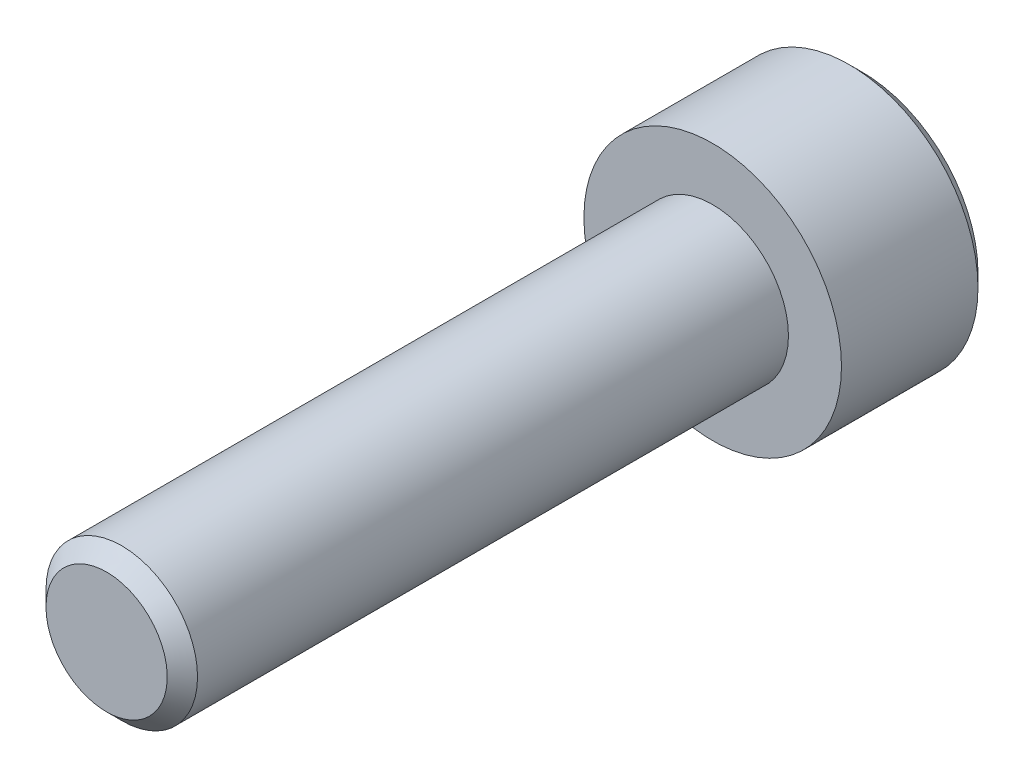
ISO-10303-21;
HEADER;
FILE_DESCRIPTION(('STEP AP214'),'2;1');
FILE_NAME('part.step','',(''),(''),'','','');
FILE_SCHEMA(('AUTOMOTIVE_DESIGN { 1 0 10303 214 1 1 1 1 }'));
ENDSEC;
DATA;
#1=APPLICATION_CONTEXT('core data for automotive mechanical design processes');
#2=APPLICATION_PROTOCOL_DEFINITION('international standard','automotive_design',2000,#1);
#3=PRODUCT_CONTEXT('',#1,'mechanical');
#4=PRODUCT('Part','Part','',(#3));
#5=PRODUCT_RELATED_PRODUCT_CATEGORY('part','',(#4));
#6=PRODUCT_DEFINITION_FORMATION('','',#4);
#7=PRODUCT_DEFINITION_CONTEXT('part definition',#1,'design');
#8=PRODUCT_DEFINITION('design','',#6,#7);
#9=PRODUCT_DEFINITION_SHAPE('','',#8);
#10=(LENGTH_UNIT() NAMED_UNIT(*) SI_UNIT(.MILLI.,.METRE.));
#11=(NAMED_UNIT(*) PLANE_ANGLE_UNIT() SI_UNIT($,.RADIAN.));
#12=(NAMED_UNIT(*) SI_UNIT($,.STERADIAN.) SOLID_ANGLE_UNIT());
#13=UNCERTAINTY_MEASURE_WITH_UNIT(LENGTH_MEASURE(1.E-05),#10,'distance_accuracy_value','');
#14=(GEOMETRIC_REPRESENTATION_CONTEXT(3) GLOBAL_UNCERTAINTY_ASSIGNED_CONTEXT((#13)) GLOBAL_UNIT_ASSIGNED_CONTEXT((#10,
#11,#12)) REPRESENTATION_CONTEXT('',''));
#15=CARTESIAN_POINT('',(0.,0.,0.));
#16=DIRECTION('',(0.,0.,1.));
#17=DIRECTION('',(1.,0.,0.));
#18=AXIS2_PLACEMENT_3D('',#15,#16,#17);
#19=CARTESIAN_POINT('',(0.,0.,-2.43));
#20=DIRECTION('',(0.,0.,1.));
#21=DIRECTION('',(1.,0.,0.));
#22=AXIS2_PLACEMENT_3D('',#19,#20,#21);
#23=PLANE('',#22);
#24=DIRECTION('',(-0.866025403784439,0.5,0.));
#25=VECTOR('',#24,1.);
#26=CARTESIAN_POINT('',(0.,2.3094010767585,-2.43));
#27=LINE('',#26,#25);
#28=CARTESIAN_POINT('',(0.,2.3094010767585,-2.43));
#29=VERTEX_POINT('',#28);
#30=CARTESIAN_POINT('',(2.,1.15470053837925,-2.43));
#31=VERTEX_POINT('',#30);
#32=EDGE_CURVE('E130',#29,#31,#27,.F.);
#33=ORIENTED_EDGE('',*,*,#32,.T.);
#34=DIRECTION('',(0.,1.,0.));
#35=VECTOR('',#34,1.);
#36=CARTESIAN_POINT('',(2.,1.15470053837925,-2.43));
#37=LINE('',#36,#35);
#38=CARTESIAN_POINT('',(2.,-1.15470053837925,-2.43));
#39=VERTEX_POINT('',#38);
#40=EDGE_CURVE('E125',#31,#39,#37,.F.);
#41=ORIENTED_EDGE('',*,*,#40,.T.);
#42=DIRECTION('',(0.866025403784439,0.499999999999999,0.));
#43=VECTOR('',#42,1.);
#44=CARTESIAN_POINT('',(2.,-1.15470053837925,-2.43));
#45=LINE('',#44,#43);
#46=CARTESIAN_POINT('',(0.,-2.3094010767585,-2.43));
#47=VERTEX_POINT('',#46);
#48=EDGE_CURVE('E74',#39,#47,#45,.F.);
#49=ORIENTED_EDGE('',*,*,#48,.T.);
#50=DIRECTION('',(0.866025403784438,-0.5,0.));
#51=VECTOR('',#50,1.);
#52=CARTESIAN_POINT('',(0.,-2.3094010767585,-2.43));
#53=LINE('',#52,#51);
#54=CARTESIAN_POINT('',(-2.,-1.15470053837925,-2.43));
#55=VERTEX_POINT('',#54);
#56=EDGE_CURVE('E71',#47,#55,#53,.F.);
#57=ORIENTED_EDGE('',*,*,#56,.T.);
#58=DIRECTION('',(0.,1.,0.));
#59=VECTOR('',#58,1.);
#60=CARTESIAN_POINT('',(-2.,-1.15470053837925,-2.43));
#61=LINE('',#60,#59);
#62=CARTESIAN_POINT('',(-2.,1.15470053837925,-2.43));
#63=VERTEX_POINT('',#62);
#64=EDGE_CURVE('E68',#55,#63,#61,.T.);
#65=ORIENTED_EDGE('',*,*,#64,.T.);
#66=DIRECTION('',(-0.866025403784439,-0.5,0.));
#67=VECTOR('',#66,1.);
#68=CARTESIAN_POINT('',(-2.,1.15470053837925,-2.43));
#69=LINE('',#68,#67);
#70=EDGE_CURVE('E91',#63,#29,#69,.F.);
#71=ORIENTED_EDGE('',*,*,#70,.T.);
#72=EDGE_LOOP('',(#33,#41,#49,#57,#65,#71));
#73=FACE_BOUND('',#72,.T.);
#74=ADVANCED_FACE('F17',(#73),#23,.F.);
#75=CARTESIAN_POINT('',(0.,-2.3094010767585,-4.93));
#76=DIRECTION('',(-0.5,-0.866025403784438,0.));
#77=DIRECTION('',(0.866025403784438,-0.5,0.));
#78=AXIS2_PLACEMENT_3D('',#75,#76,#77);
#79=PLANE('',#78);
#80=ORIENTED_EDGE('',*,*,#56,.F.);
#81=DIRECTION('',(0.,0.,1.));
#82=VECTOR('',#81,1.);
#83=CARTESIAN_POINT('',(0.,-2.3094010767585,-4.93));
#84=LINE('',#83,#82);
#85=CARTESIAN_POINT('',(0.,-2.3094010767585,-4.93));
#86=VERTEX_POINT('',#85);
#87=EDGE_CURVE('E120',#47,#86,#84,.F.);
#88=ORIENTED_EDGE('',*,*,#87,.T.);
#89=DIRECTION('',(-0.866025403784439,0.5,0.));
#90=VECTOR('',#89,1.);
#91=CARTESIAN_POINT('',(0.,-2.3094010767585,-4.93));
#92=LINE('',#91,#90);
#93=CARTESIAN_POINT('',(-2.,-1.15470053837925,-4.93));
#94=VERTEX_POINT('',#93);
#95=EDGE_CURVE('E82',#86,#94,#92,.T.);
#96=ORIENTED_EDGE('',*,*,#95,.T.);
#97=DIRECTION('',(0.,0.,1.));
#98=VECTOR('',#97,1.);
#99=CARTESIAN_POINT('',(-2.,-1.15470053837925,-4.93));
#100=LINE('',#99,#98);
#101=EDGE_CURVE('E77',#94,#55,#100,.T.);
#102=ORIENTED_EDGE('',*,*,#101,.T.);
#103=EDGE_LOOP('',(#80,#88,#96,#102));
#104=FACE_BOUND('',#103,.T.);
#105=ADVANCED_FACE('F80',(#104),#79,.F.);
#106=CARTESIAN_POINT('',(-2.,-1.15470053837925,-4.93));
#107=DIRECTION('',(-1.,0.,0.));
#108=DIRECTION('',(0.,0.,1.));
#109=AXIS2_PLACEMENT_3D('',#106,#107,#108);
#110=PLANE('',#109);
#111=ORIENTED_EDGE('',*,*,#64,.F.);
#112=ORIENTED_EDGE('',*,*,#101,.F.);
#113=DIRECTION('',(0.,1.,0.));
#114=VECTOR('',#113,1.);
#115=CARTESIAN_POINT('',(-2.,0.,-4.93));
#116=LINE('',#115,#114);
#117=CARTESIAN_POINT('',(-2.,1.15470053837925,-4.93));
#118=VERTEX_POINT('',#117);
#119=EDGE_CURVE('E117',#94,#118,#116,.T.);
#120=ORIENTED_EDGE('',*,*,#119,.T.);
#121=DIRECTION('',(0.,0.,1.));
#122=VECTOR('',#121,1.);
#123=CARTESIAN_POINT('',(-2.,1.15470053837925,-4.93));
#124=LINE('',#123,#122);
#125=EDGE_CURVE('E88',#118,#63,#124,.T.);
#126=ORIENTED_EDGE('',*,*,#125,.T.);
#127=EDGE_LOOP('',(#111,#112,#120,#126));
#128=FACE_BOUND('',#127,.T.);
#129=ADVANCED_FACE('F86',(#128),#110,.F.);
#130=CARTESIAN_POINT('',(-2.,1.15470053837925,-4.93));
#131=DIRECTION('',(-0.5,0.866025403784439,0.));
#132=DIRECTION('',(-0.866025403784439,-0.5,0.));
#133=AXIS2_PLACEMENT_3D('',#130,#131,#132);
#134=PLANE('',#133);
#135=ORIENTED_EDGE('',*,*,#70,.F.);
#136=ORIENTED_EDGE('',*,*,#125,.F.);
#137=DIRECTION('',(0.866025403784439,0.499999999999999,0.));
#138=VECTOR('',#137,1.);
#139=CARTESIAN_POINT('',(-2.,1.15470053837925,-4.93));
#140=LINE('',#139,#138);
#141=CARTESIAN_POINT('',(0.,2.3094010767585,-4.93));
#142=VERTEX_POINT('',#141);
#143=EDGE_CURVE('E115',#118,#142,#140,.T.);
#144=ORIENTED_EDGE('',*,*,#143,.T.);
#145=DIRECTION('',(0.,0.,1.));
#146=VECTOR('',#145,1.);
#147=CARTESIAN_POINT('',(0.,2.3094010767585,-4.93));
#148=LINE('',#147,#146);
#149=EDGE_CURVE('E132',#142,#29,#148,.T.);
#150=ORIENTED_EDGE('',*,*,#149,.T.);
#151=EDGE_LOOP('',(#135,#136,#144,#150));
#152=FACE_BOUND('',#151,.T.);
#153=ADVANCED_FACE('F137',(#152),#134,.F.);
#154=CARTESIAN_POINT('',(0.,2.3094010767585,-4.93));
#155=DIRECTION('',(0.5,0.866025403784439,0.));
#156=DIRECTION('',(-0.866025403784439,0.5,0.));
#157=AXIS2_PLACEMENT_3D('',#154,#155,#156);
#158=PLANE('',#157);
#159=ORIENTED_EDGE('',*,*,#32,.F.);
#160=ORIENTED_EDGE('',*,*,#149,.F.);
#161=DIRECTION('',(0.866025403784439,-0.5,0.));
#162=VECTOR('',#161,1.);
#163=CARTESIAN_POINT('',(0.,2.3094010767585,-4.93));
#164=LINE('',#163,#162);
#165=CARTESIAN_POINT('',(2.,1.15470053837925,-4.93));
#166=VERTEX_POINT('',#165);
#167=EDGE_CURVE('E113',#142,#166,#164,.T.);
#168=ORIENTED_EDGE('',*,*,#167,.T.);
#169=DIRECTION('',(0.,0.,-1.));
#170=VECTOR('',#169,1.);
#171=CARTESIAN_POINT('',(2.,1.15470053837925,-4.93));
#172=LINE('',#171,#170);
#173=EDGE_CURVE('E127',#166,#31,#172,.F.);
#174=ORIENTED_EDGE('',*,*,#173,.T.);
#175=EDGE_LOOP('',(#159,#160,#168,#174));
#176=FACE_BOUND('',#175,.T.);
#177=ADVANCED_FACE('F141',(#176),#158,.F.);
#178=CARTESIAN_POINT('',(2.,1.15470053837925,-4.93));
#179=DIRECTION('',(1.,0.,0.));
#180=DIRECTION('',(0.,0.,-1.));
#181=AXIS2_PLACEMENT_3D('',#178,#179,#180);
#182=PLANE('',#181);
#183=ORIENTED_EDGE('',*,*,#40,.F.);
#184=ORIENTED_EDGE('',*,*,#173,.F.);
#185=DIRECTION('',(0.,1.,0.));
#186=VECTOR('',#185,1.);
#187=CARTESIAN_POINT('',(2.,0.,-4.93));
#188=LINE('',#187,#186);
#189=CARTESIAN_POINT('',(2.,-1.15470053837925,-4.93));
#190=VERTEX_POINT('',#189);
#191=EDGE_CURVE('E35',#166,#190,#188,.F.);
#192=ORIENTED_EDGE('',*,*,#191,.T.);
#193=DIRECTION('',(0.,0.,1.));
#194=VECTOR('',#193,1.);
#195=CARTESIAN_POINT('',(2.,-1.15470053837925,-4.93));
#196=LINE('',#195,#194);
#197=EDGE_CURVE('E123',#190,#39,#196,.T.);
#198=ORIENTED_EDGE('',*,*,#197,.T.);
#199=EDGE_LOOP('',(#183,#184,#192,#198));
#200=FACE_BOUND('',#199,.T.);
#201=ADVANCED_FACE('F143',(#200),#182,.F.);
#202=CARTESIAN_POINT('',(2.,-1.15470053837925,-4.93));
#203=DIRECTION('',(0.499999999999999,-0.866025403784439,0.));
#204=DIRECTION('',(0.866025403784439,0.499999999999999,0.));
#205=AXIS2_PLACEMENT_3D('',#202,#203,#204);
#206=PLANE('',#205);
#207=ORIENTED_EDGE('',*,*,#48,.F.);
#208=ORIENTED_EDGE('',*,*,#197,.F.);
#209=DIRECTION('',(-0.866025403784439,-0.499999999999999,0.));
#210=VECTOR('',#209,1.);
#211=CARTESIAN_POINT('',(2.,-1.15470053837925,-4.93));
#212=LINE('',#211,#210);
#213=EDGE_CURVE('E107',#190,#86,#212,.T.);
#214=ORIENTED_EDGE('',*,*,#213,.T.);
#215=ORIENTED_EDGE('',*,*,#87,.F.);
#216=EDGE_LOOP('',(#207,#208,#214,#215));
#217=FACE_BOUND('',#216,.T.);
#218=ADVANCED_FACE('F146',(#217),#206,.F.);
#219=CARTESIAN_POINT('',(0.,0.,-4.93));
#220=DIRECTION('',(0.,0.,1.));
#221=DIRECTION('',(1.,0.,0.));
#222=AXIS2_PLACEMENT_3D('',#219,#220,#221);
#223=PLANE('',#222);
#224=ORIENTED_EDGE('',*,*,#191,.F.);
#225=ORIENTED_EDGE('',*,*,#167,.F.);
#226=ORIENTED_EDGE('',*,*,#143,.F.);
#227=ORIENTED_EDGE('',*,*,#119,.F.);
#228=ORIENTED_EDGE('',*,*,#95,.F.);
#229=ORIENTED_EDGE('',*,*,#213,.F.);
#230=EDGE_LOOP('',(#224,#225,#226,#227,#228,#229));
#231=FACE_BOUND('',#230,.T.);
#232=CARTESIAN_POINT('',(0.,0.,-4.9300000000585));
#233=DIRECTION('',(0.,0.,1.));
#234=DIRECTION('',(1.,0.,0.));
#235=AXIS2_PLACEMENT_3D('',#232,#233,#234);
#236=CIRCLE('',#235,3.82500000000618);
#237=CARTESIAN_POINT('',(3.82500000000618,0.,-4.9300000000585));
#238=VERTEX_POINT('',#237);
#239=EDGE_CURVE('E20',#238,#238,#236,.T.);
#240=ORIENTED_EDGE('',*,*,#239,.F.);
#241=EDGE_LOOP('',(#240));
#242=FACE_BOUND('',#241,.T.);
#243=ADVANCED_FACE('F148',(#231,#242),#223,.F.);
#244=CARTESIAN_POINT('',(0.,0.,-4.50499999999465));
#245=DIRECTION('',(0.,0.,1.));
#246=DIRECTION('',(1.,0.,0.));
#247=AXIS2_PLACEMENT_3D('',#244,#245,#246);
#248=CONICAL_SURFACE('',#247,4.25000000007003,0.785398163397448);
#249=ORIENTED_EDGE('',*,*,#239,.T.);
#250=EDGE_LOOP('',(#249));
#251=FACE_BOUND('',#250,.T.);
#252=CARTESIAN_POINT('',(0.,0.,-4.505));
#253=DIRECTION('',(0.,0.,1.));
#254=DIRECTION('',(1.,0.,0.));
#255=AXIS2_PLACEMENT_3D('',#252,#253,#254);
#256=CIRCLE('',#255,4.25);
#257=CARTESIAN_POINT('',(4.25,0.,-4.505));
#258=VERTEX_POINT('',#257);
#259=EDGE_CURVE('E99',#258,#258,#256,.T.);
#260=ORIENTED_EDGE('',*,*,#259,.F.);
#261=EDGE_LOOP('',(#260));
#262=FACE_BOUND('',#261,.T.);
#263=ADVANCED_FACE('F151',(#251,#262),#248,.T.);
#264=CARTESIAN_POINT('',(0.,0.,20.));
#265=DIRECTION('',(0.,0.,1.));
#266=DIRECTION('',(1.,0.,0.));
#267=AXIS2_PLACEMENT_3D('',#264,#265,#266);
#268=PLANE('',#267);
#269=CARTESIAN_POINT('',(0.,0.,19.9999999999818));
#270=DIRECTION('',(0.,0.,-1.));
#271=DIRECTION('',(-1.,0.,0.));
#272=AXIS2_PLACEMENT_3D('',#269,#270,#271);
#273=CIRCLE('',#272,1.99999999995271);
#274=CARTESIAN_POINT('',(-1.99999999995271,0.,19.9999999999818));
#275=VERTEX_POINT('',#274);
#276=EDGE_CURVE('E97',#275,#275,#273,.T.);
#277=ORIENTED_EDGE('',*,*,#276,.F.);
#278=EDGE_LOOP('',(#277));
#279=FACE_BOUND('',#278,.T.);
#280=ADVANCED_FACE('F157',(#279),#268,.T.);
#281=CARTESIAN_POINT('',(0.,0.,-4.93));
#282=DIRECTION('',(0.,0.,1.));
#283=DIRECTION('',(1.,0.,0.));
#284=AXIS2_PLACEMENT_3D('',#281,#282,#283);
#285=CYLINDRICAL_SURFACE('',#284,4.25);
#286=ORIENTED_EDGE('',*,*,#259,.T.);
#287=EDGE_LOOP('',(#286));
#288=FACE_BOUND('',#287,.T.);
#289=CARTESIAN_POINT('',(0.,0.,0.));
#290=DIRECTION('',(0.,0.,1.));
#291=DIRECTION('',(1.,0.,0.));
#292=AXIS2_PLACEMENT_3D('',#289,#290,#291);
#293=CIRCLE('',#292,4.25);
#294=CARTESIAN_POINT('',(4.25,0.,0.));
#295=VERTEX_POINT('',#294);
#296=EDGE_CURVE('E95',#295,#295,#293,.T.);
#297=ORIENTED_EDGE('',*,*,#296,.F.);
#298=EDGE_LOOP('',(#297));
#299=FACE_BOUND('',#298,.T.);
#300=ADVANCED_FACE('F163',(#288,#299),#285,.T.);
#301=CARTESIAN_POINT('',(0.,0.,19.4999999998799));
#302=DIRECTION('',(0.,0.,-1.));
#303=DIRECTION('',(-1.,0.,0.));
#304=AXIS2_PLACEMENT_3D('',#301,#302,#303);
#305=CONICAL_SURFACE('',#304,2.50000000005457,0.785398163397448);
#306=CARTESIAN_POINT('',(0.,0.,19.5));
#307=DIRECTION('',(0.,0.,1.));
#308=DIRECTION('',(1.,0.,0.));
#309=AXIS2_PLACEMENT_3D('',#306,#307,#308);
#310=CIRCLE('',#309,2.5);
#311=CARTESIAN_POINT('',(2.5,0.,19.5));
#312=VERTEX_POINT('',#311);
#313=EDGE_CURVE('E26',#312,#312,#310,.F.);
#314=ORIENTED_EDGE('',*,*,#313,.F.);
#315=EDGE_LOOP('',(#314));
#316=FACE_BOUND('',#315,.T.);
#317=ORIENTED_EDGE('',*,*,#276,.T.);
#318=EDGE_LOOP('',(#317));
#319=FACE_BOUND('',#318,.T.);
#320=ADVANCED_FACE('F174',(#316,#319),#305,.T.);
#321=CARTESIAN_POINT('',(0.,0.,0.));
#322=DIRECTION('',(0.,0.,1.));
#323=DIRECTION('',(1.,0.,0.));
#324=AXIS2_PLACEMENT_3D('',#321,#322,#323);
#325=PLANE('',#324);
#326=CARTESIAN_POINT('',(0.,0.,0.));
#327=DIRECTION('',(0.,0.,1.));
#328=DIRECTION('',(1.,0.,0.));
#329=AXIS2_PLACEMENT_3D('',#326,#327,#328);
#330=CIRCLE('',#329,2.5);
#331=CARTESIAN_POINT('',(2.5,0.,0.));
#332=VERTEX_POINT('',#331);
#333=EDGE_CURVE('E11',#332,#332,#330,.T.);
#334=ORIENTED_EDGE('',*,*,#333,.F.);
#335=EDGE_LOOP('',(#334));
#336=FACE_BOUND('',#335,.T.);
#337=ORIENTED_EDGE('',*,*,#296,.T.);
#338=EDGE_LOOP('',(#337));
#339=FACE_BOUND('',#338,.T.);
#340=ADVANCED_FACE('F168',(#336,#339),#325,.T.);
#341=CARTESIAN_POINT('',(0.,0.,0.));
#342=DIRECTION('',(0.,0.,1.));
#343=DIRECTION('',(1.,0.,0.));
#344=AXIS2_PLACEMENT_3D('',#341,#342,#343);
#345=CYLINDRICAL_SURFACE('',#344,2.5);
#346=ORIENTED_EDGE('',*,*,#333,.T.);
#347=EDGE_LOOP('',(#346));
#348=FACE_BOUND('',#347,.T.);
#349=ORIENTED_EDGE('',*,*,#313,.T.);
#350=EDGE_LOOP('',(#349));
#351=FACE_BOUND('',#350,.T.);
#352=ADVANCED_FACE('F166',(#348,#351),#345,.T.);
#353=CLOSED_SHELL('',(#74,#105,#129,#153,#177,#201,#218,#243,#263,#280,#300,#320,#340,#352));
#354=MANIFOLD_SOLID_BREP('B1',#353);
#355=ADVANCED_BREP_SHAPE_REPRESENTATION('',(#18,#354),#14);
#356=SHAPE_DEFINITION_REPRESENTATION(#9,#355);
ENDSEC;
END-ISO-10303-21;
